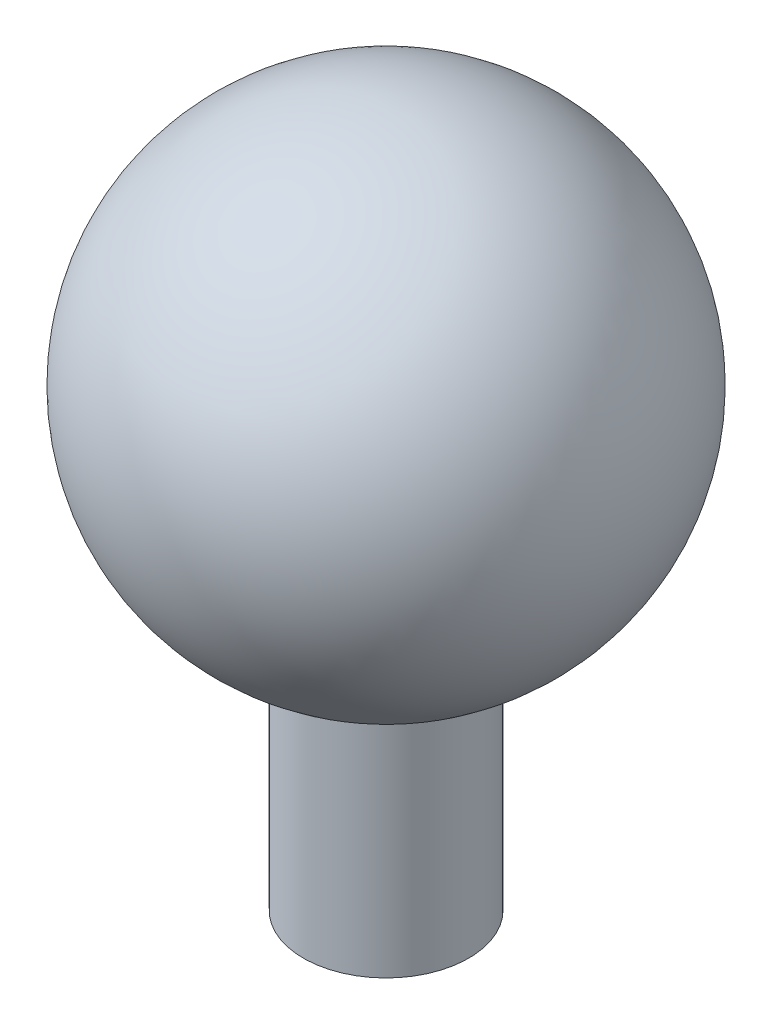
ISO-10303-21;
HEADER;
FILE_DESCRIPTION(('STEP AP214'),'2;1');
FILE_NAME('part.step','',(''),(''),'','','');
FILE_SCHEMA(('AUTOMOTIVE_DESIGN { 1 0 10303 214 1 1 1 1 }'));
ENDSEC;
DATA;
#1=APPLICATION_CONTEXT('core data for automotive mechanical design processes');
#2=APPLICATION_PROTOCOL_DEFINITION('international standard','automotive_design',2000,#1);
#3=PRODUCT_CONTEXT('',#1,'mechanical');
#4=PRODUCT('Part','Part','',(#3));
#5=PRODUCT_RELATED_PRODUCT_CATEGORY('part','',(#4));
#6=PRODUCT_DEFINITION_FORMATION('','',#4);
#7=PRODUCT_DEFINITION_CONTEXT('part definition',#1,'design');
#8=PRODUCT_DEFINITION('design','',#6,#7);
#9=PRODUCT_DEFINITION_SHAPE('','',#8);
#10=(LENGTH_UNIT() NAMED_UNIT(*) SI_UNIT(.MILLI.,.METRE.));
#11=(NAMED_UNIT(*) PLANE_ANGLE_UNIT() SI_UNIT($,.RADIAN.));
#12=(NAMED_UNIT(*) SI_UNIT($,.STERADIAN.) SOLID_ANGLE_UNIT());
#13=UNCERTAINTY_MEASURE_WITH_UNIT(LENGTH_MEASURE(1.E-05),#10,'distance_accuracy_value','');
#14=(GEOMETRIC_REPRESENTATION_CONTEXT(3) GLOBAL_UNCERTAINTY_ASSIGNED_CONTEXT((#13)) GLOBAL_UNIT_ASSIGNED_CONTEXT((#10,
#11,#12)) REPRESENTATION_CONTEXT('',''));
#15=CARTESIAN_POINT('',(0.,0.,0.));
#16=DIRECTION('',(0.,0.,1.));
#17=DIRECTION('',(1.,0.,0.));
#18=AXIS2_PLACEMENT_3D('',#15,#16,#17);
#19=CARTESIAN_POINT('',(2.91067214271289,-0.141534070256795,0.));
#20=DIRECTION('',(0.,0.,-1.));
#21=DIRECTION('',(-1.,0.,0.));
#22=AXIS2_PLACEMENT_3D('',#19,#20,#21);
#23=CIRCLE('',#22,30.);
#24=TRIMMED_CURVE('',#23,(PARAMETER_VALUE(-1.47362105601273)),
(PARAMETER_VALUE(1.47362105601273)),.T.,.PARAMETER.);
#25=CARTESIAN_POINT('',(0.,-0.141534070256796,0.));
#26=DIRECTION('',(0.,1.,0.));
#27=AXIS1_PLACEMENT('',#25,#26);
#28=SURFACE_OF_REVOLUTION('',#24,#27);
#29=CARTESIAN_POINT('',(0.,-30.,0.));
#30=VERTEX_POINT('',#29);
#31=VERTEX_LOOP('',#30);
#32=FACE_BOUND('',#31,.T.);
#33=CARTESIAN_POINT('',(0.,-27.2213151776324,0.));
#34=DIRECTION('',(0.,1.,0.));
#35=DIRECTION('',(-1.,0.,0.));
#36=AXIS2_PLACEMENT_3D('',#33,#34,#35);
#37=CIRCLE('',#36,10.);
#38=CARTESIAN_POINT('',(-10.,-27.2213151776324,0.));
#39=VERTEX_POINT('',#38);
#40=EDGE_CURVE('E47',#39,#39,#37,.T.);
#41=ORIENTED_EDGE('',*,*,#40,.T.);
#42=EDGE_LOOP('',(#41));
#43=FACE_BOUND('',#42,.T.);
#44=ADVANCED_FACE('F41',(#32,#43),#28,.F.);
#45=CARTESIAN_POINT('',(0.,-55.,0.));
#46=DIRECTION('',(0.,1.,0.));
#47=DIRECTION('',(-1.,0.,0.));
#48=AXIS2_PLACEMENT_3D('',#45,#46,#47);
#49=PLANE('',#48);
#50=CARTESIAN_POINT('',(0.,-55.,0.));
#51=DIRECTION('',(0.,1.,0.));
#52=DIRECTION('',(-1.,0.,0.));
#53=AXIS2_PLACEMENT_3D('',#50,#51,#52);
#54=CIRCLE('',#53,10.);
#55=CARTESIAN_POINT('',(-10.,-55.,0.));
#56=VERTEX_POINT('',#55);
#57=EDGE_CURVE('E12',#56,#56,#54,.T.);
#58=ORIENTED_EDGE('',*,*,#57,.F.);
#59=EDGE_LOOP('',(#58));
#60=FACE_BOUND('',#59,.T.);
#61=ADVANCED_FACE('F52',(#60),#49,.F.);
#62=CARTESIAN_POINT('',(0.,-30.,0.));
#63=DIRECTION('',(0.,1.,0.));
#64=DIRECTION('',(-1.,0.,0.));
#65=AXIS2_PLACEMENT_3D('',#62,#63,#64);
#66=CYLINDRICAL_SURFACE('',#65,10.);
#67=ORIENTED_EDGE('',*,*,#40,.F.);
#68=EDGE_LOOP('',(#67));
#69=FACE_BOUND('',#68,.T.);
#70=ORIENTED_EDGE('',*,*,#57,.T.);
#71=EDGE_LOOP('',(#70));
#72=FACE_BOUND('',#71,.T.);
#73=ADVANCED_FACE('F56',(#69,#72),#66,.T.);
#74=CLOSED_SHELL('',(#44,#61,#73));
#75=MANIFOLD_SOLID_BREP('B2',#74);
#76=CARTESIAN_POINT('',(0.,0.,0.));
#77=DIRECTION('',(0.,1.,0.));
#78=DIRECTION('',(-1.,0.,0.));
#79=AXIS2_PLACEMENT_3D('',#76,#77,#78);
#80=SPHERICAL_SURFACE('',#79,29.);
#81=CARTESIAN_POINT('',(0.,29.,0.));
#82=VERTEX_POINT('',#81);
#83=VERTEX_LOOP('',#82);
#84=FACE_BOUND('',#83,.T.);
#85=ADVANCED_FACE('F84',(#84),#80,.T.);
#86=CLOSED_SHELL('',(#85));
#87=MANIFOLD_SOLID_BREP('B6',#86);
#88=ADVANCED_BREP_SHAPE_REPRESENTATION('',(#18,#75,#87),#14);
#89=SHAPE_DEFINITION_REPRESENTATION(#9,#88);
ENDSEC;
END-ISO-10303-21;
